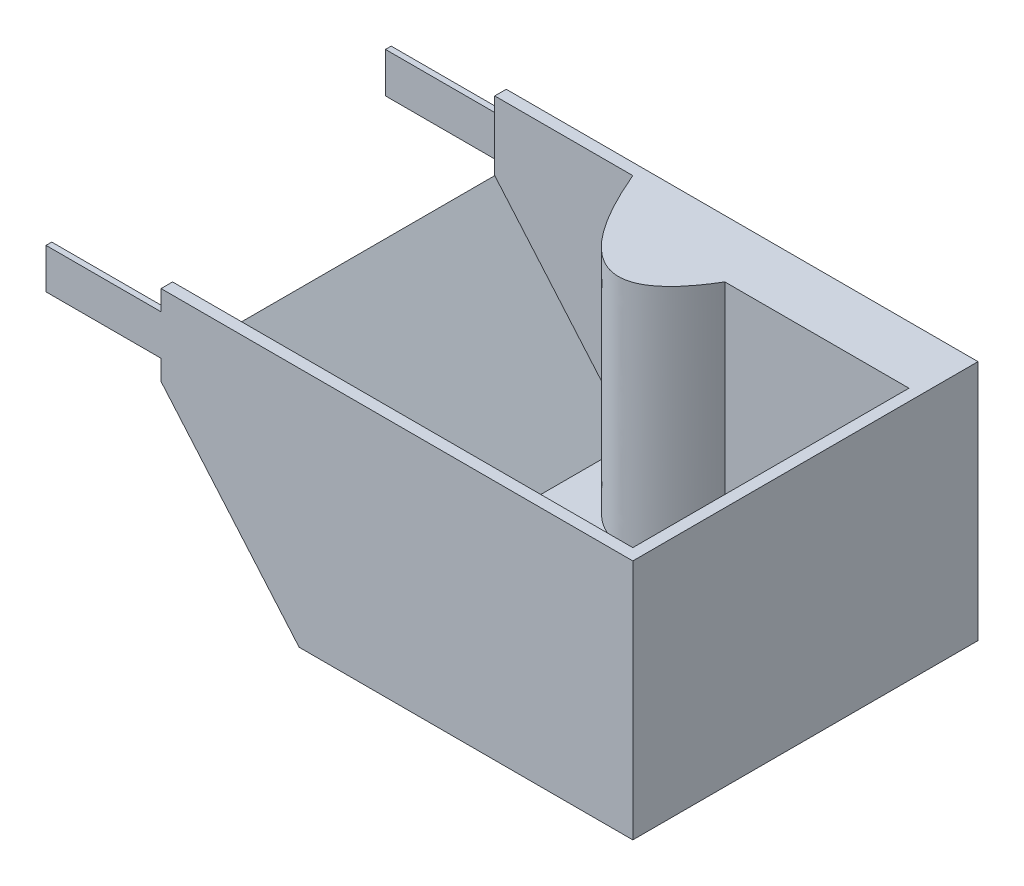
ISO-10303-21;
HEADER;
FILE_DESCRIPTION(('STEP AP214'),'2;1');
FILE_NAME('part.step','',(''),(''),'','','');
FILE_SCHEMA(('AUTOMOTIVE_DESIGN { 1 0 10303 214 1 1 1 1 }'));
ENDSEC;
DATA;
#1=APPLICATION_CONTEXT('core data for automotive mechanical design processes');
#2=APPLICATION_PROTOCOL_DEFINITION('international standard','automotive_design',2000,#1);
#3=PRODUCT_CONTEXT('',#1,'mechanical');
#4=PRODUCT('Part','Part','',(#3));
#5=PRODUCT_RELATED_PRODUCT_CATEGORY('part','',(#4));
#6=PRODUCT_DEFINITION_FORMATION('','',#4);
#7=PRODUCT_DEFINITION_CONTEXT('part definition',#1,'design');
#8=PRODUCT_DEFINITION('design','',#6,#7);
#9=PRODUCT_DEFINITION_SHAPE('','',#8);
#10=(LENGTH_UNIT() NAMED_UNIT(*) SI_UNIT(.MILLI.,.METRE.));
#11=(NAMED_UNIT(*) PLANE_ANGLE_UNIT() SI_UNIT($,.RADIAN.));
#12=(NAMED_UNIT(*) SI_UNIT($,.STERADIAN.) SOLID_ANGLE_UNIT());
#13=UNCERTAINTY_MEASURE_WITH_UNIT(LENGTH_MEASURE(1.E-05),#10,'distance_accuracy_value','');
#14=(GEOMETRIC_REPRESENTATION_CONTEXT(3) GLOBAL_UNCERTAINTY_ASSIGNED_CONTEXT((#13)) GLOBAL_UNIT_ASSIGNED_CONTEXT((#10,
#11,#12)) REPRESENTATION_CONTEXT('',''));
#15=CARTESIAN_POINT('',(0.,0.,0.));
#16=DIRECTION('',(0.,0.,1.));
#17=DIRECTION('',(1.,0.,0.));
#18=AXIS2_PLACEMENT_3D('',#15,#16,#17);
#19=CARTESIAN_POINT('',(0.,0.,0.));
#20=DIRECTION('',(0.,1.,0.));
#21=DIRECTION('',(0.,0.,1.));
#22=AXIS2_PLACEMENT_3D('',#19,#20,#21);
#23=PLANE('',#22);
#24=DIRECTION('',(1.,0.,0.));
#25=VECTOR('',#24,1.);
#26=CARTESIAN_POINT('',(205.,0.,75.));
#27=LINE('',#26,#25);
#28=CARTESIAN_POINT('',(60.,0.,75.));
#29=VERTEX_POINT('',#28);
#30=CARTESIAN_POINT('',(205.,0.,75.));
#31=VERTEX_POINT('',#30);
#32=EDGE_CURVE('E399',#29,#31,#27,.T.);
#33=ORIENTED_EDGE('',*,*,#32,.F.);
#34=DIRECTION('',(0.,0.,1.));
#35=VECTOR('',#34,1.);
#36=CARTESIAN_POINT('',(59.9999999999999,0.,0.));
#37=LINE('',#36,#35);
#38=CARTESIAN_POINT('',(60.,0.,-75.));
#39=VERTEX_POINT('',#38);
#40=EDGE_CURVE('E419',#39,#29,#37,.T.);
#41=ORIENTED_EDGE('',*,*,#40,.F.);
#42=DIRECTION('',(-1.,0.,0.));
#43=VECTOR('',#42,1.);
#44=CARTESIAN_POINT('',(205.,0.,-75.));
#45=LINE('',#44,#43);
#46=CARTESIAN_POINT('',(205.,0.,-75.));
#47=VERTEX_POINT('',#46);
#48=EDGE_CURVE('E362',#47,#39,#45,.T.);
#49=ORIENTED_EDGE('',*,*,#48,.F.);
#50=DIRECTION('',(0.,0.,-1.));
#51=VECTOR('',#50,1.);
#52=CARTESIAN_POINT('',(205.,0.,70.));
#53=LINE('',#52,#51);
#54=EDGE_CURVE('E412',#31,#47,#53,.T.);
#55=ORIENTED_EDGE('',*,*,#54,.F.);
#56=EDGE_LOOP('',(#33,#41,#49,#55));
#57=FACE_BOUND('',#56,.T.);
#58=DIRECTION('',(-0.441048342692887,0.,-0.897483347705047));
#59=VECTOR('',#58,1.);
#60=CARTESIAN_POINT('',(80.5243463199901,0.,-39.5719091409054));
#61=LINE('',#60,#59);
#62=CARTESIAN_POINT('',(74.1645236577121,0.,-52.5134268414404));
#63=VERTEX_POINT('',#62);
#64=CARTESIAN_POINT('',(65.5711340079739,0.,-70.0000000000461));
#65=VERTEX_POINT('',#64);
#66=EDGE_CURVE('E11',#63,#65,#61,.T.);
#67=ORIENTED_EDGE('',*,*,#66,.F.);
#68=CARTESIAN_POINT('',(117.163331799698,0.,-55.0000000000231));
#69=CARTESIAN_POINT('',(116.553479191234,0.,-53.981059510543));
#70=CARTESIAN_POINT('',(115.343994579537,0.,-51.9514046548711));
#71=CARTESIAN_POINT('',(113.624065501285,0.,-49.1814546831016));
#72=CARTESIAN_POINT('',(110.189825419192,0.,-44.2104508586249));
#73=CARTESIAN_POINT('',(105.056898875719,0.,-38.4546529421594));
#74=CARTESIAN_POINT('',(100.423455415618,0.,-35.2649296639802));
#75=CARTESIAN_POINT('',(97.5016606306143,0.,-34.1854911410515));
#76=CARTESIAN_POINT('',(95.3279976327904,0.,-33.8470054094748));
#77=CARTESIAN_POINT('',(93.1935049100601,0.,-33.9721451617414));
#78=CARTESIAN_POINT('',(90.3912236348587,0.,-34.735002624501));
#79=CARTESIAN_POINT('',(85.9480138081782,0.,-37.3661686518529));
#80=CARTESIAN_POINT('',(78.7900084926035,0.,-44.7360629850614));
#81=CARTESIAN_POINT('',(74.1645236577121,0.,-52.5134268414404));
#82=B_SPLINE_CURVE_WITH_KNOTS('',2,(#68,#69,#70,#71,#72,#73,#74,#75,#76,#77,#78,#79,#80,#81),
.UNSPECIFIED.,.F.,.F.,(3,1,1,1,1,1,1,1,1,1,1,1,3),(-0.0287937041367771,-0.00472778565105365,
0.0193381328346698,0.0674699698061166,0.16373364374901,0.292085209006202,0.388348882949095,
0.452524665577691,0.516700448206287,0.580876230834882,0.677139904777776,0.805491470034968,
0.998018817920755),.UNSPECIFIED.);
#83=CARTESIAN_POINT('',(117.163331799698,0.,-55.0000000000231));
#84=VERTEX_POINT('',#83);
#85=EDGE_CURVE('E484',#84,#63,#82,.T.);
#86=ORIENTED_EDGE('',*,*,#85,.F.);
#87=DIRECTION('',(1.,0.,0.));
#88=VECTOR('',#87,1.);
#89=CARTESIAN_POINT('',(0.,0.,-55.0000000000231));
#90=LINE('',#89,#88);
#91=CARTESIAN_POINT('',(195.,0.,-55.0000000000231));
#92=VERTEX_POINT('',#91);
#93=EDGE_CURVE('E489',#84,#92,#90,.T.);
#94=ORIENTED_EDGE('',*,*,#93,.T.);
#95=DIRECTION('',(0.,0.,-1.));
#96=VECTOR('',#95,1.);
#97=CARTESIAN_POINT('',(195.,0.,0.));
#98=LINE('',#97,#96);
#99=CARTESIAN_POINT('',(195.,0.,-70.0000000000461));
#100=VERTEX_POINT('',#99);
#101=EDGE_CURVE('E496',#92,#100,#98,.T.);
#102=ORIENTED_EDGE('',*,*,#101,.T.);
#103=DIRECTION('',(1.,0.,0.));
#104=VECTOR('',#103,1.);
#105=CARTESIAN_POINT('',(0.,0.,-70.0000000000461));
#106=LINE('',#105,#104);
#107=EDGE_CURVE('E50',#65,#100,#106,.T.);
#108=ORIENTED_EDGE('',*,*,#107,.F.);
#109=EDGE_LOOP('',(#67,#86,#94,#102,#108));
#110=FACE_BOUND('',#109,.T.);
#111=ADVANCED_FACE('F40',(#57,#110),#23,.F.);
#112=CARTESIAN_POINT('',(0.,0.,70.));
#113=DIRECTION('',(0.,0.,-1.));
#114=DIRECTION('',(-1.,0.,0.));
#115=AXIS2_PLACEMENT_3D('',#112,#113,#114);
#116=PLANE('',#115);
#117=DIRECTION('',(1.,0.,0.));
#118=VECTOR('',#117,1.);
#119=CARTESIAN_POINT('',(0.,5.,70.));
#120=LINE('',#119,#118);
#121=CARTESIAN_POINT('',(59.9999999999999,5.,70.));
#122=VERTEX_POINT('',#121);
#123=CARTESIAN_POINT('',(200.,5.,70.));
#124=VERTEX_POINT('',#123);
#125=EDGE_CURVE('E429',#122,#124,#120,.T.);
#126=ORIENTED_EDGE('',*,*,#125,.F.);
#127=DIRECTION('',(-0.650791373455968,0.759256602365297,0.));
#128=VECTOR('',#127,1.);
#129=CARTESIAN_POINT('',(59.9999999999999,5.,70.));
#130=LINE('',#129,#128);
#131=CARTESIAN_POINT('',(0.,75.,70.));
#132=VERTEX_POINT('',#131);
#133=EDGE_CURVE('E344',#122,#132,#130,.T.);
#134=ORIENTED_EDGE('',*,*,#133,.T.);
#135=DIRECTION('',(0.,-1.,0.));
#136=VECTOR('',#135,1.);
#137=CARTESIAN_POINT('',(0.,105.,70.));
#138=LINE('',#137,#136);
#139=CARTESIAN_POINT('',(0.,105.,70.));
#140=VERTEX_POINT('',#139);
#141=EDGE_CURVE('E391',#140,#132,#138,.T.);
#142=ORIENTED_EDGE('',*,*,#141,.F.);
#143=DIRECTION('',(-1.,0.,0.));
#144=VECTOR('',#143,1.);
#145=CARTESIAN_POINT('',(205.,105.,70.));
#146=LINE('',#145,#144);
#147=CARTESIAN_POINT('',(200.,105.,70.));
#148=VERTEX_POINT('',#147);
#149=EDGE_CURVE('E385',#148,#140,#146,.T.);
#150=ORIENTED_EDGE('',*,*,#149,.F.);
#151=DIRECTION('',(0.,-1.,0.));
#152=VECTOR('',#151,1.);
#153=CARTESIAN_POINT('',(200.,0.,70.));
#154=LINE('',#153,#152);
#155=EDGE_CURVE('E411',#148,#124,#154,.T.);
#156=ORIENTED_EDGE('',*,*,#155,.T.);
#157=EDGE_LOOP('',(#126,#134,#142,#150,#156));
#158=FACE_BOUND('',#157,.T.);
#159=ADVANCED_FACE('F517',(#158),#116,.T.);
#160=CARTESIAN_POINT('',(0.,0.,-70.));
#161=DIRECTION('',(0.,0.,1.));
#162=DIRECTION('',(1.,0.,0.));
#163=AXIS2_PLACEMENT_3D('',#160,#161,#162);
#164=PLANE('',#163);
#165=DIRECTION('',(0.,1.,0.));
#166=VECTOR('',#165,1.);
#167=CARTESIAN_POINT('',(0.,0.,-70.));
#168=LINE('',#167,#166);
#169=CARTESIAN_POINT('',(0.,75.,-70.));
#170=VERTEX_POINT('',#169);
#171=CARTESIAN_POINT('',(0.,105.,-70.));
#172=VERTEX_POINT('',#171);
#173=EDGE_CURVE('E357',#170,#172,#168,.T.);
#174=ORIENTED_EDGE('',*,*,#173,.F.);
#175=DIRECTION('',(-0.650791373455968,0.759256602365297,0.));
#176=VECTOR('',#175,1.);
#177=CARTESIAN_POINT('',(59.9999999999999,5.,-70.));
#178=LINE('',#177,#176);
#179=CARTESIAN_POINT('',(59.9999999999999,5.,-70.));
#180=VERTEX_POINT('',#179);
#181=EDGE_CURVE('E343',#180,#170,#178,.T.);
#182=ORIENTED_EDGE('',*,*,#181,.F.);
#183=DIRECTION('',(0.,-1.,0.));
#184=VECTOR('',#183,1.);
#185=CARTESIAN_POINT('',(59.9999999999999,105.,-70.));
#186=LINE('',#185,#184);
#187=CARTESIAN_POINT('',(60.,105.,-70.));
#188=VERTEX_POINT('',#187);
#189=EDGE_CURVE('E459',#188,#180,#186,.T.);
#190=ORIENTED_EDGE('',*,*,#189,.F.);
#191=DIRECTION('',(1.,0.,0.));
#192=VECTOR('',#191,1.);
#193=CARTESIAN_POINT('',(205.,105.,-70.));
#194=LINE('',#193,#192);
#195=EDGE_CURVE('E363',#172,#188,#194,.T.);
#196=ORIENTED_EDGE('',*,*,#195,.F.);
#197=EDGE_LOOP('',(#174,#182,#190,#196));
#198=FACE_BOUND('',#197,.T.);
#199=ADVANCED_FACE('F525',(#198),#164,.T.);
#200=CARTESIAN_POINT('',(59.9999999999999,105.,-70.));
#201=CARTESIAN_POINT('',(89.7639468296247,105.,0.562785514085895));
#202=CARTESIAN_POINT('',(120.,105.,-50.));
#203=B_SPLINE_CURVE_WITH_KNOTS('',2,(#200,#201,#202),.UNSPECIFIED.,.F.,.F.,(3,3),(0.,1.),.UNSPECIFIED.);
#204=DIRECTION('',(0.,-1.,0.));
#205=VECTOR('',#204,1.);
#206=SURFACE_OF_LINEAR_EXTRUSION('',#203,#205);
#207=ORIENTED_EDGE('',*,*,#189,.T.);
#208=CARTESIAN_POINT('',(59.9999999999999,5.,-70.));
#209=CARTESIAN_POINT('',(89.7639468296247,5.,0.562785514085895));
#210=CARTESIAN_POINT('',(120.,5.,-50.));
#211=B_SPLINE_CURVE_WITH_KNOTS('',2,(#208,#209,#210),.UNSPECIFIED.,.F.,.F.,(3,3),(0.,1.),.UNSPECIFIED.);
#212=CARTESIAN_POINT('',(120.,5.,-50.));
#213=VERTEX_POINT('',#212);
#214=EDGE_CURVE('E430',#180,#213,#211,.T.);
#215=ORIENTED_EDGE('',*,*,#214,.T.);
#216=DIRECTION('',(0.,-1.,0.));
#217=VECTOR('',#216,1.);
#218=CARTESIAN_POINT('',(120.,105.,-50.));
#219=LINE('',#218,#217);
#220=CARTESIAN_POINT('',(120.,105.,-50.));
#221=VERTEX_POINT('',#220);
#222=EDGE_CURVE('E456',#221,#213,#219,.T.);
#223=ORIENTED_EDGE('',*,*,#222,.F.);
#224=EDGE_CURVE('E439',#188,#221,#203,.T.);
#225=ORIENTED_EDGE('',*,*,#224,.F.);
#226=EDGE_LOOP('',(#207,#215,#223,#225));
#227=FACE_BOUND('',#226,.T.);
#228=ADVANCED_FACE('F42',(#227),#206,.F.);
#229=CARTESIAN_POINT('',(0.,105.,-50.));
#230=DIRECTION('',(0.,0.,1.));
#231=DIRECTION('',(1.,0.,0.));
#232=AXIS2_PLACEMENT_3D('',#229,#230,#231);
#233=PLANE('',#232);
#234=DIRECTION('',(-1.,0.,0.));
#235=VECTOR('',#234,1.);
#236=CARTESIAN_POINT('',(0.,5.,-50.));
#237=LINE('',#236,#235);
#238=CARTESIAN_POINT('',(200.,5.,-50.));
#239=VERTEX_POINT('',#238);
#240=EDGE_CURVE('E437',#239,#213,#237,.T.);
#241=ORIENTED_EDGE('',*,*,#240,.F.);
#242=DIRECTION('',(0.,-1.,0.));
#243=VECTOR('',#242,1.);
#244=CARTESIAN_POINT('',(200.,105.,-50.));
#245=LINE('',#244,#243);
#246=CARTESIAN_POINT('',(200.,105.,-50.));
#247=VERTEX_POINT('',#246);
#248=EDGE_CURVE('E452',#247,#239,#245,.T.);
#249=ORIENTED_EDGE('',*,*,#248,.F.);
#250=DIRECTION('',(-1.,0.,0.));
#251=VECTOR('',#250,1.);
#252=CARTESIAN_POINT('',(0.,105.,-50.));
#253=LINE('',#252,#251);
#254=EDGE_CURVE('E445',#247,#221,#253,.T.);
#255=ORIENTED_EDGE('',*,*,#254,.T.);
#256=ORIENTED_EDGE('',*,*,#222,.T.);
#257=EDGE_LOOP('',(#241,#249,#255,#256));
#258=FACE_BOUND('',#257,.T.);
#259=ADVANCED_FACE('F532',(#258),#233,.T.);
#260=CARTESIAN_POINT('',(0.,105.,0.));
#261=DIRECTION('',(0.,1.,0.));
#262=DIRECTION('',(0.,0.,1.));
#263=AXIS2_PLACEMENT_3D('',#260,#261,#262);
#264=PLANE('',#263);
#265=DIRECTION('',(0.,0.,1.));
#266=VECTOR('',#265,1.);
#267=CARTESIAN_POINT('',(205.,105.,70.));
#268=LINE('',#267,#266);
#269=CARTESIAN_POINT('',(205.,105.,-75.));
#270=VERTEX_POINT('',#269);
#271=CARTESIAN_POINT('',(205.,105.,75.));
#272=VERTEX_POINT('',#271);
#273=EDGE_CURVE('E415',#270,#272,#268,.T.);
#274=ORIENTED_EDGE('',*,*,#273,.F.);
#275=DIRECTION('',(1.,0.,0.));
#276=VECTOR('',#275,1.);
#277=CARTESIAN_POINT('',(205.,105.,-75.));
#278=LINE('',#277,#276);
#279=CARTESIAN_POINT('',(0.,105.,-75.));
#280=VERTEX_POINT('',#279);
#281=EDGE_CURVE('E372',#280,#270,#278,.T.);
#282=ORIENTED_EDGE('',*,*,#281,.F.);
#283=DIRECTION('',(0.,0.,1.));
#284=VECTOR('',#283,1.);
#285=CARTESIAN_POINT('',(0.,105.,-75.));
#286=LINE('',#285,#284);
#287=EDGE_CURVE('E376',#280,#172,#286,.T.);
#288=ORIENTED_EDGE('',*,*,#287,.T.);
#289=ORIENTED_EDGE('',*,*,#195,.T.);
#290=ORIENTED_EDGE('',*,*,#224,.T.);
#291=ORIENTED_EDGE('',*,*,#254,.F.);
#292=DIRECTION('',(0.,0.,1.));
#293=VECTOR('',#292,1.);
#294=CARTESIAN_POINT('',(200.,105.,70.));
#295=LINE('',#294,#293);
#296=EDGE_CURVE('E416',#247,#148,#295,.T.);
#297=ORIENTED_EDGE('',*,*,#296,.T.);
#298=ORIENTED_EDGE('',*,*,#149,.T.);
#299=DIRECTION('',(0.,0.,-1.));
#300=VECTOR('',#299,1.);
#301=CARTESIAN_POINT('',(0.,105.,75.));
#302=LINE('',#301,#300);
#303=CARTESIAN_POINT('',(0.,105.,75.));
#304=VERTEX_POINT('',#303);
#305=EDGE_CURVE('E402',#304,#140,#302,.T.);
#306=ORIENTED_EDGE('',*,*,#305,.F.);
#307=DIRECTION('',(-1.,0.,0.));
#308=VECTOR('',#307,1.);
#309=CARTESIAN_POINT('',(205.,105.,75.));
#310=LINE('',#309,#308);
#311=EDGE_CURVE('E390',#272,#304,#310,.T.);
#312=ORIENTED_EDGE('',*,*,#311,.F.);
#313=EDGE_LOOP('',(#274,#282,#288,#289,#290,#291,#297,#298,#306,#312));
#314=FACE_BOUND('',#313,.T.);
#315=ADVANCED_FACE('F530',(#314),#264,.T.);
#316=CARTESIAN_POINT('',(0.,5.,0.));
#317=DIRECTION('',(0.,1.,0.));
#318=DIRECTION('',(0.,0.,1.));
#319=AXIS2_PLACEMENT_3D('',#316,#317,#318);
#320=PLANE('',#319);
#321=ORIENTED_EDGE('',*,*,#214,.F.);
#322=DIRECTION('',(0.,0.,1.));
#323=VECTOR('',#322,1.);
#324=CARTESIAN_POINT('',(59.9999999999999,5.,0.));
#325=LINE('',#324,#323);
#326=EDGE_CURVE('E425',#180,#122,#325,.T.);
#327=ORIENTED_EDGE('',*,*,#326,.T.);
#328=ORIENTED_EDGE('',*,*,#125,.T.);
#329=DIRECTION('',(0.,0.,1.));
#330=VECTOR('',#329,1.);
#331=CARTESIAN_POINT('',(200.,5.,0.));
#332=LINE('',#331,#330);
#333=EDGE_CURVE('E433',#239,#124,#332,.T.);
#334=ORIENTED_EDGE('',*,*,#333,.F.);
#335=ORIENTED_EDGE('',*,*,#240,.T.);
#336=EDGE_LOOP('',(#321,#327,#328,#334,#335));
#337=FACE_BOUND('',#336,.T.);
#338=ADVANCED_FACE('F539',(#337),#320,.T.);
#339=CARTESIAN_POINT('',(205.,0.,0.));
#340=DIRECTION('',(-1.,0.,0.));
#341=DIRECTION('',(0.,0.,1.));
#342=AXIS2_PLACEMENT_3D('',#339,#340,#341);
#343=PLANE('',#342);
#344=ORIENTED_EDGE('',*,*,#273,.T.);
#345=DIRECTION('',(0.,1.,0.));
#346=VECTOR('',#345,1.);
#347=CARTESIAN_POINT('',(205.,105.,75.));
#348=LINE('',#347,#346);
#349=EDGE_CURVE('E386',#31,#272,#348,.T.);
#350=ORIENTED_EDGE('',*,*,#349,.F.);
#351=ORIENTED_EDGE('',*,*,#54,.T.);
#352=DIRECTION('',(0.,-1.,0.));
#353=VECTOR('',#352,1.);
#354=CARTESIAN_POINT('',(205.,0.,-75.));
#355=LINE('',#354,#353);
#356=EDGE_CURVE('E358',#270,#47,#355,.T.);
#357=ORIENTED_EDGE('',*,*,#356,.F.);
#358=EDGE_LOOP('',(#344,#350,#351,#357));
#359=FACE_BOUND('',#358,.T.);
#360=ADVANCED_FACE('F573',(#359),#343,.F.);
#361=CARTESIAN_POINT('',(200.,0.,0.));
#362=DIRECTION('',(-1.,0.,0.));
#363=DIRECTION('',(0.,0.,1.));
#364=AXIS2_PLACEMENT_3D('',#361,#362,#363);
#365=PLANE('',#364);
#366=ORIENTED_EDGE('',*,*,#296,.F.);
#367=ORIENTED_EDGE('',*,*,#248,.T.);
#368=ORIENTED_EDGE('',*,*,#333,.T.);
#369=ORIENTED_EDGE('',*,*,#155,.F.);
#370=EDGE_LOOP('',(#366,#367,#368,#369));
#371=FACE_BOUND('',#370,.T.);
#372=ADVANCED_FACE('F549',(#371),#365,.T.);
#373=CARTESIAN_POINT('',(0.,105.,75.));
#374=DIRECTION('',(1.,0.,0.));
#375=DIRECTION('',(0.,1.,0.));
#376=AXIS2_PLACEMENT_3D('',#373,#374,#375);
#377=PLANE('',#376);
#378=DIRECTION('',(0.,1.,0.));
#379=VECTOR('',#378,1.);
#380=CARTESIAN_POINT('',(0.,0.,-75.));
#381=LINE('',#380,#379);
#382=CARTESIAN_POINT('',(0.,96.25,-75.));
#383=VERTEX_POINT('',#382);
#384=EDGE_CURVE('E367',#383,#280,#381,.T.);
#385=ORIENTED_EDGE('',*,*,#384,.F.);
#386=DIRECTION('',(0.,0.,1.));
#387=VECTOR('',#386,1.);
#388=CARTESIAN_POINT('',(0.,96.25,75.));
#389=LINE('',#388,#387);
#390=CARTESIAN_POINT('',(0.,96.25,-72.5));
#391=VERTEX_POINT('',#390);
#392=EDGE_CURVE('E296',#383,#391,#389,.T.);
#393=ORIENTED_EDGE('',*,*,#392,.T.);
#394=DIRECTION('',(0.,1.,0.));
#395=VECTOR('',#394,1.);
#396=CARTESIAN_POINT('',(0.,105.,-72.5));
#397=LINE('',#396,#395);
#398=CARTESIAN_POINT('',(0.,78.75,-72.5));
#399=VERTEX_POINT('',#398);
#400=EDGE_CURVE('E481',#399,#391,#397,.T.);
#401=ORIENTED_EDGE('',*,*,#400,.F.);
#402=DIRECTION('',(0.,0.,1.));
#403=VECTOR('',#402,1.);
#404=CARTESIAN_POINT('',(0.,78.75,75.));
#405=LINE('',#404,#403);
#406=CARTESIAN_POINT('',(0.,78.75,-75.));
#407=VERTEX_POINT('',#406);
#408=EDGE_CURVE('E290',#407,#399,#405,.T.);
#409=ORIENTED_EDGE('',*,*,#408,.F.);
#410=CARTESIAN_POINT('',(0.,70.,-75.));
#411=VERTEX_POINT('',#410);
#412=EDGE_CURVE('E368',#411,#407,#381,.T.);
#413=ORIENTED_EDGE('',*,*,#412,.F.);
#414=DIRECTION('',(0.,0.,-1.));
#415=VECTOR('',#414,1.);
#416=CARTESIAN_POINT('',(0.,70.,70.));
#417=LINE('',#416,#415);
#418=CARTESIAN_POINT('',(0.,70.,75.));
#419=VERTEX_POINT('',#418);
#420=EDGE_CURVE('E354',#419,#411,#417,.T.);
#421=ORIENTED_EDGE('',*,*,#420,.F.);
#422=DIRECTION('',(0.,-1.,0.));
#423=VECTOR('',#422,1.);
#424=CARTESIAN_POINT('',(0.,105.,75.));
#425=LINE('',#424,#423);
#426=CARTESIAN_POINT('',(0.,78.75,75.));
#427=VERTEX_POINT('',#426);
#428=EDGE_CURVE('E394',#427,#419,#425,.T.);
#429=ORIENTED_EDGE('',*,*,#428,.F.);
#430=DIRECTION('',(0.,0.,-1.));
#431=VECTOR('',#430,1.);
#432=CARTESIAN_POINT('',(0.,78.75,75.));
#433=LINE('',#432,#431);
#434=CARTESIAN_POINT('',(0.,78.75,72.5));
#435=VERTEX_POINT('',#434);
#436=EDGE_CURVE('E331',#427,#435,#433,.T.);
#437=ORIENTED_EDGE('',*,*,#436,.T.);
#438=DIRECTION('',(0.,-1.,0.));
#439=VECTOR('',#438,1.);
#440=CARTESIAN_POINT('',(0.,105.,72.5));
#441=LINE('',#440,#439);
#442=CARTESIAN_POINT('',(0.,96.25,72.5));
#443=VERTEX_POINT('',#442);
#444=EDGE_CURVE('E475',#443,#435,#441,.T.);
#445=ORIENTED_EDGE('',*,*,#444,.F.);
#446=DIRECTION('',(0.,0.,-1.));
#447=VECTOR('',#446,1.);
#448=CARTESIAN_POINT('',(0.,96.25,75.));
#449=LINE('',#448,#447);
#450=CARTESIAN_POINT('',(0.,96.25,75.));
#451=VERTEX_POINT('',#450);
#452=EDGE_CURVE('E326',#451,#443,#449,.T.);
#453=ORIENTED_EDGE('',*,*,#452,.F.);
#454=EDGE_CURVE('E395',#304,#451,#425,.T.);
#455=ORIENTED_EDGE('',*,*,#454,.F.);
#456=ORIENTED_EDGE('',*,*,#305,.T.);
#457=ORIENTED_EDGE('',*,*,#141,.T.);
#458=DIRECTION('',(0.,0.,-1.));
#459=VECTOR('',#458,1.);
#460=CARTESIAN_POINT('',(0.,75.,70.));
#461=LINE('',#460,#459);
#462=EDGE_CURVE('E348',#132,#170,#461,.T.);
#463=ORIENTED_EDGE('',*,*,#462,.T.);
#464=ORIENTED_EDGE('',*,*,#173,.T.);
#465=ORIENTED_EDGE('',*,*,#287,.F.);
#466=EDGE_LOOP('',(#385,#393,#401,#409,#413,#421,#429,#437,#445,#453,#455,#456,#457,#463,#464,#465));
#467=FACE_BOUND('',#466,.T.);
#468=ADVANCED_FACE('F562',(#467),#377,.F.);
#469=CARTESIAN_POINT('',(0.,0.,75.));
#470=DIRECTION('',(0.,0.,-1.));
#471=DIRECTION('',(-1.,0.,0.));
#472=AXIS2_PLACEMENT_3D('',#469,#470,#471);
#473=PLANE('',#472);
#474=ORIENTED_EDGE('',*,*,#454,.T.);
#475=DIRECTION('',(1.,0.,0.));
#476=VECTOR('',#475,1.);
#477=CARTESIAN_POINT('',(0.,96.25,75.));
#478=LINE('',#477,#476);
#479=CARTESIAN_POINT('',(-50.,96.25,75.));
#480=VERTEX_POINT('',#479);
#481=EDGE_CURVE('E300',#480,#451,#478,.T.);
#482=ORIENTED_EDGE('',*,*,#481,.F.);
#483=DIRECTION('',(0.,-1.,0.));
#484=VECTOR('',#483,1.);
#485=CARTESIAN_POINT('',(-50.,0.,75.));
#486=LINE('',#485,#484);
#487=CARTESIAN_POINT('',(-50.,78.75,75.));
#488=VERTEX_POINT('',#487);
#489=EDGE_CURVE('E317',#480,#488,#486,.T.);
#490=ORIENTED_EDGE('',*,*,#489,.T.);
#491=DIRECTION('',(1.,0.,0.));
#492=VECTOR('',#491,1.);
#493=CARTESIAN_POINT('',(0.,78.75,75.));
#494=LINE('',#493,#492);
#495=EDGE_CURVE('E306',#488,#427,#494,.T.);
#496=ORIENTED_EDGE('',*,*,#495,.T.);
#497=ORIENTED_EDGE('',*,*,#428,.T.);
#498=DIRECTION('',(-0.650791373455968,0.759256602365297,0.));
#499=VECTOR('',#498,1.);
#500=CARTESIAN_POINT('',(60.,0.,75.));
#501=LINE('',#500,#499);
#502=EDGE_CURVE('E335',#29,#419,#501,.T.);
#503=ORIENTED_EDGE('',*,*,#502,.F.);
#504=ORIENTED_EDGE('',*,*,#32,.T.);
#505=ORIENTED_EDGE('',*,*,#349,.T.);
#506=ORIENTED_EDGE('',*,*,#311,.T.);
#507=EDGE_LOOP('',(#474,#482,#490,#496,#497,#503,#504,#505,#506));
#508=FACE_BOUND('',#507,.T.);
#509=ADVANCED_FACE('F569',(#508),#473,.F.);
#510=CARTESIAN_POINT('',(0.,0.,-75.));
#511=DIRECTION('',(0.,0.,1.));
#512=DIRECTION('',(1.,0.,0.));
#513=AXIS2_PLACEMENT_3D('',#510,#511,#512);
#514=PLANE('',#513);
#515=ORIENTED_EDGE('',*,*,#412,.T.);
#516=DIRECTION('',(1.,0.,0.));
#517=VECTOR('',#516,1.);
#518=CARTESIAN_POINT('',(0.,78.75,-75.));
#519=LINE('',#518,#517);
#520=CARTESIAN_POINT('',(-50.,78.75,-75.));
#521=VERTEX_POINT('',#520);
#522=EDGE_CURVE('E282',#521,#407,#519,.T.);
#523=ORIENTED_EDGE('',*,*,#522,.F.);
#524=DIRECTION('',(0.,-1.,0.));
#525=VECTOR('',#524,1.);
#526=CARTESIAN_POINT('',(-50.,0.,-75.));
#527=LINE('',#526,#525);
#528=CARTESIAN_POINT('',(-50.,96.25,-75.));
#529=VERTEX_POINT('',#528);
#530=EDGE_CURVE('E272',#529,#521,#527,.T.);
#531=ORIENTED_EDGE('',*,*,#530,.F.);
#532=DIRECTION('',(1.,0.,0.));
#533=VECTOR('',#532,1.);
#534=CARTESIAN_POINT('',(0.,96.25,-75.));
#535=LINE('',#534,#533);
#536=EDGE_CURVE('E65',#529,#383,#535,.T.);
#537=ORIENTED_EDGE('',*,*,#536,.T.);
#538=ORIENTED_EDGE('',*,*,#384,.T.);
#539=ORIENTED_EDGE('',*,*,#281,.T.);
#540=ORIENTED_EDGE('',*,*,#356,.T.);
#541=ORIENTED_EDGE('',*,*,#48,.T.);
#542=DIRECTION('',(-0.650791373455968,0.759256602365297,0.));
#543=VECTOR('',#542,1.);
#544=CARTESIAN_POINT('',(60.,0.,-75.));
#545=LINE('',#544,#543);
#546=EDGE_CURVE('E339',#39,#411,#545,.T.);
#547=ORIENTED_EDGE('',*,*,#546,.T.);
#548=EDGE_LOOP('',(#515,#523,#531,#537,#538,#539,#540,#541,#547));
#549=FACE_BOUND('',#548,.T.);
#550=ADVANCED_FACE('F576',(#549),#514,.F.);
#551=CARTESIAN_POINT('',(60.,0.,70.));
#552=DIRECTION('',(0.759256602365297,0.650791373455968,0.));
#553=DIRECTION('',(-0.650791373455968,0.759256602365297,0.));
#554=AXIS2_PLACEMENT_3D('',#551,#552,#553);
#555=PLANE('',#554);
#556=ORIENTED_EDGE('',*,*,#420,.T.);
#557=ORIENTED_EDGE('',*,*,#546,.F.);
#558=ORIENTED_EDGE('',*,*,#40,.T.);
#559=ORIENTED_EDGE('',*,*,#502,.T.);
#560=EDGE_LOOP('',(#556,#557,#558,#559));
#561=FACE_BOUND('',#560,.T.);
#562=ADVANCED_FACE('F591',(#561),#555,.F.);
#563=CARTESIAN_POINT('',(59.9999999999999,5.,70.));
#564=DIRECTION('',(-0.759256602365297,-0.650791373455968,0.));
#565=DIRECTION('',(0.650791373455968,-0.759256602365297,0.));
#566=AXIS2_PLACEMENT_3D('',#563,#564,#565);
#567=PLANE('',#566);
#568=ORIENTED_EDGE('',*,*,#181,.T.);
#569=ORIENTED_EDGE('',*,*,#462,.F.);
#570=ORIENTED_EDGE('',*,*,#133,.F.);
#571=ORIENTED_EDGE('',*,*,#326,.F.);
#572=EDGE_LOOP('',(#568,#569,#570,#571));
#573=FACE_BOUND('',#572,.T.);
#574=ADVANCED_FACE('F622',(#573),#567,.F.);
#575=CARTESIAN_POINT('',(0.,0.,72.5));
#576=DIRECTION('',(0.,0.,1.));
#577=DIRECTION('',(1.,0.,0.));
#578=AXIS2_PLACEMENT_3D('',#575,#576,#577);
#579=PLANE('',#578);
#580=DIRECTION('',(1.,0.,0.));
#581=VECTOR('',#580,1.);
#582=CARTESIAN_POINT('',(0.,96.25,72.5));
#583=LINE('',#582,#581);
#584=CARTESIAN_POINT('',(-50.,96.25,72.5));
#585=VERTEX_POINT('',#584);
#586=EDGE_CURVE('E301',#585,#443,#583,.T.);
#587=ORIENTED_EDGE('',*,*,#586,.T.);
#588=ORIENTED_EDGE('',*,*,#444,.T.);
#589=DIRECTION('',(1.,0.,0.));
#590=VECTOR('',#589,1.);
#591=CARTESIAN_POINT('',(0.,78.75,72.5));
#592=LINE('',#591,#590);
#593=CARTESIAN_POINT('',(-50.,78.75,72.5));
#594=VERTEX_POINT('',#593);
#595=EDGE_CURVE('E310',#594,#435,#592,.T.);
#596=ORIENTED_EDGE('',*,*,#595,.F.);
#597=DIRECTION('',(0.,-1.,0.));
#598=VECTOR('',#597,1.);
#599=CARTESIAN_POINT('',(-50.,0.,72.5));
#600=LINE('',#599,#598);
#601=EDGE_CURVE('E305',#585,#594,#600,.T.);
#602=ORIENTED_EDGE('',*,*,#601,.F.);
#603=EDGE_LOOP('',(#587,#588,#596,#602));
#604=FACE_BOUND('',#603,.T.);
#605=ADVANCED_FACE('F618',(#604),#579,.F.);
#606=CARTESIAN_POINT('',(0.,78.75,72.5));
#607=DIRECTION('',(0.,-1.,0.));
#608=DIRECTION('',(0.,0.,-1.));
#609=AXIS2_PLACEMENT_3D('',#606,#607,#608);
#610=PLANE('',#609);
#611=ORIENTED_EDGE('',*,*,#436,.F.);
#612=ORIENTED_EDGE('',*,*,#495,.F.);
#613=DIRECTION('',(0.,0.,1.));
#614=VECTOR('',#613,1.);
#615=CARTESIAN_POINT('',(-50.,78.75,72.5));
#616=LINE('',#615,#614);
#617=EDGE_CURVE('E323',#594,#488,#616,.T.);
#618=ORIENTED_EDGE('',*,*,#617,.F.);
#619=ORIENTED_EDGE('',*,*,#595,.T.);
#620=EDGE_LOOP('',(#611,#612,#618,#619));
#621=FACE_BOUND('',#620,.T.);
#622=ADVANCED_FACE('F621',(#621),#610,.T.);
#623=CARTESIAN_POINT('',(0.,96.25,72.5));
#624=DIRECTION('',(0.,-1.,0.));
#625=DIRECTION('',(0.,0.,-1.));
#626=AXIS2_PLACEMENT_3D('',#623,#624,#625);
#627=PLANE('',#626);
#628=ORIENTED_EDGE('',*,*,#481,.T.);
#629=ORIENTED_EDGE('',*,*,#452,.T.);
#630=ORIENTED_EDGE('',*,*,#586,.F.);
#631=DIRECTION('',(0.,0.,1.));
#632=VECTOR('',#631,1.);
#633=CARTESIAN_POINT('',(-50.,96.25,72.5));
#634=LINE('',#633,#632);
#635=EDGE_CURVE('E314',#585,#480,#634,.T.);
#636=ORIENTED_EDGE('',*,*,#635,.T.);
#637=EDGE_LOOP('',(#628,#629,#630,#636));
#638=FACE_BOUND('',#637,.T.);
#639=ADVANCED_FACE('F626',(#638),#627,.F.);
#640=CARTESIAN_POINT('',(-50.,0.,72.5));
#641=DIRECTION('',(-1.,0.,0.));
#642=DIRECTION('',(0.,0.,1.));
#643=AXIS2_PLACEMENT_3D('',#640,#641,#642);
#644=PLANE('',#643);
#645=ORIENTED_EDGE('',*,*,#489,.F.);
#646=ORIENTED_EDGE('',*,*,#635,.F.);
#647=ORIENTED_EDGE('',*,*,#601,.T.);
#648=ORIENTED_EDGE('',*,*,#617,.T.);
#649=EDGE_LOOP('',(#645,#646,#647,#648));
#650=FACE_BOUND('',#649,.T.);
#651=ADVANCED_FACE('F628',(#650),#644,.T.);
#652=CARTESIAN_POINT('',(0.,0.,-72.5));
#653=DIRECTION('',(0.,0.,-1.));
#654=DIRECTION('',(-1.,0.,0.));
#655=AXIS2_PLACEMENT_3D('',#652,#653,#654);
#656=PLANE('',#655);
#657=DIRECTION('',(1.,0.,0.));
#658=VECTOR('',#657,1.);
#659=CARTESIAN_POINT('',(0.,78.75,-72.5));
#660=LINE('',#659,#658);
#661=CARTESIAN_POINT('',(-50.,78.75,-72.5));
#662=VERTEX_POINT('',#661);
#663=EDGE_CURVE('E271',#662,#399,#660,.T.);
#664=ORIENTED_EDGE('',*,*,#663,.T.);
#665=ORIENTED_EDGE('',*,*,#400,.T.);
#666=DIRECTION('',(1.,0.,0.));
#667=VECTOR('',#666,1.);
#668=CARTESIAN_POINT('',(0.,96.25,-72.5));
#669=LINE('',#668,#667);
#670=CARTESIAN_POINT('',(-50.,96.25,-72.5));
#671=VERTEX_POINT('',#670);
#672=EDGE_CURVE('E267',#671,#391,#669,.T.);
#673=ORIENTED_EDGE('',*,*,#672,.F.);
#674=DIRECTION('',(0.,-1.,0.));
#675=VECTOR('',#674,1.);
#676=CARTESIAN_POINT('',(-50.,0.,-72.5));
#677=LINE('',#676,#675);
#678=EDGE_CURVE('E276',#671,#662,#677,.T.);
#679=ORIENTED_EDGE('',*,*,#678,.T.);
#680=EDGE_LOOP('',(#664,#665,#673,#679));
#681=FACE_BOUND('',#680,.T.);
#682=ADVANCED_FACE('F600',(#681),#656,.F.);
#683=CARTESIAN_POINT('',(0.,96.25,-72.5));
#684=DIRECTION('',(0.,1.,0.));
#685=DIRECTION('',(0.,0.,1.));
#686=AXIS2_PLACEMENT_3D('',#683,#684,#685);
#687=PLANE('',#686);
#688=ORIENTED_EDGE('',*,*,#392,.F.);
#689=ORIENTED_EDGE('',*,*,#536,.F.);
#690=DIRECTION('',(0.,0.,-1.));
#691=VECTOR('',#690,1.);
#692=CARTESIAN_POINT('',(-50.,96.25,-72.5));
#693=LINE('',#692,#691);
#694=EDGE_CURVE('E287',#671,#529,#693,.T.);
#695=ORIENTED_EDGE('',*,*,#694,.F.);
#696=ORIENTED_EDGE('',*,*,#672,.T.);
#697=EDGE_LOOP('',(#688,#689,#695,#696));
#698=FACE_BOUND('',#697,.T.);
#699=ADVANCED_FACE('F602',(#698),#687,.T.);
#700=CARTESIAN_POINT('',(0.,78.75,-72.5));
#701=DIRECTION('',(0.,1.,0.));
#702=DIRECTION('',(0.,0.,1.));
#703=AXIS2_PLACEMENT_3D('',#700,#701,#702);
#704=PLANE('',#703);
#705=ORIENTED_EDGE('',*,*,#522,.T.);
#706=ORIENTED_EDGE('',*,*,#408,.T.);
#707=ORIENTED_EDGE('',*,*,#663,.F.);
#708=DIRECTION('',(0.,0.,-1.));
#709=VECTOR('',#708,1.);
#710=CARTESIAN_POINT('',(-50.,78.75,-72.5));
#711=LINE('',#710,#709);
#712=EDGE_CURVE('E279',#662,#521,#711,.T.);
#713=ORIENTED_EDGE('',*,*,#712,.T.);
#714=EDGE_LOOP('',(#705,#706,#707,#713));
#715=FACE_BOUND('',#714,.T.);
#716=ADVANCED_FACE('F594',(#715),#704,.F.);
#717=CARTESIAN_POINT('',(-50.,0.,-72.5));
#718=DIRECTION('',(1.,0.,0.));
#719=DIRECTION('',(0.,1.,0.));
#720=AXIS2_PLACEMENT_3D('',#717,#718,#719);
#721=PLANE('',#720);
#722=ORIENTED_EDGE('',*,*,#530,.T.);
#723=ORIENTED_EDGE('',*,*,#712,.F.);
#724=ORIENTED_EDGE('',*,*,#678,.F.);
#725=ORIENTED_EDGE('',*,*,#694,.T.);
#726=EDGE_LOOP('',(#722,#723,#724,#725));
#727=FACE_BOUND('',#726,.T.);
#728=ADVANCED_FACE('F605',(#727),#721,.F.);
#729=CARTESIAN_POINT('',(74.1645236577121,-40.,-52.5134268414404));
#730=DIRECTION('',(0.897483347705047,0.,-0.441048342692887));
#731=DIRECTION('',(-0.441048342692887,0.,-0.897483347705047));
#732=AXIS2_PLACEMENT_3D('',#729,#730,#731);
#733=PLANE('',#732);
#734=ORIENTED_EDGE('',*,*,#66,.T.);
#735=DIRECTION('',(0.,1.,0.));
#736=VECTOR('',#735,1.);
#737=CARTESIAN_POINT('',(65.5711340079739,-40.,-70.0000000000461));
#738=LINE('',#737,#736);
#739=CARTESIAN_POINT('',(65.5711340079739,100.,-70.0000000000461));
#740=VERTEX_POINT('',#739);
#741=EDGE_CURVE('E206',#65,#740,#738,.T.);
#742=ORIENTED_EDGE('',*,*,#741,.T.);
#743=CARTESIAN_POINT('',(74.1645236577121,100.,-52.5134268414404));
#744=CARTESIAN_POINT('',(65.5711340079739,100.,-70.0000000000461));
#745=B_SPLINE_CURVE_WITH_KNOTS('',1,(#743,#744),.UNSPECIFIED.,.F.,.F.,(2,2),
(0.00308667899547303,0.319061538330727),.UNSPECIFIED.);
#746=CARTESIAN_POINT('',(74.1645236577121,100.,-52.5134268414404));
#747=VERTEX_POINT('',#746);
#748=EDGE_CURVE('E211',#747,#740,#745,.T.);
#749=ORIENTED_EDGE('',*,*,#748,.F.);
#750=DIRECTION('',(0.,1.,0.));
#751=VECTOR('',#750,1.);
#752=CARTESIAN_POINT('',(74.1645236577121,-40.,-52.5134268414404));
#753=LINE('',#752,#751);
#754=EDGE_CURVE('E254',#63,#747,#753,.T.);
#755=ORIENTED_EDGE('',*,*,#754,.F.);
#756=EDGE_LOOP('',(#734,#742,#749,#755));
#757=FACE_BOUND('',#756,.T.);
#758=ADVANCED_FACE('F208',(#757),#733,.T.);
#759=CARTESIAN_POINT('',(65.5711340079739,-40.,-70.0000000000461));
#760=DIRECTION('',(0.,0.,1.));
#761=DIRECTION('',(1.,0.,0.));
#762=AXIS2_PLACEMENT_3D('',#759,#760,#761);
#763=PLANE('',#762);
#764=ORIENTED_EDGE('',*,*,#107,.T.);
#765=DIRECTION('',(0.,1.,0.));
#766=VECTOR('',#765,1.);
#767=CARTESIAN_POINT('',(195.,-40.,-70.0000000000461));
#768=LINE('',#767,#766);
#769=CARTESIAN_POINT('',(195.,100.,-70.0000000000461));
#770=VERTEX_POINT('',#769);
#771=EDGE_CURVE('E216',#100,#770,#768,.T.);
#772=ORIENTED_EDGE('',*,*,#771,.T.);
#773=DIRECTION('',(1.,0.,0.));
#774=VECTOR('',#773,1.);
#775=CARTESIAN_POINT('',(65.5711340079739,100.,-70.0000000000461));
#776=LINE('',#775,#774);
#777=EDGE_CURVE('E219',#740,#770,#776,.T.);
#778=ORIENTED_EDGE('',*,*,#777,.F.);
#779=ORIENTED_EDGE('',*,*,#741,.F.);
#780=EDGE_LOOP('',(#764,#772,#778,#779));
#781=FACE_BOUND('',#780,.T.);
#782=ADVANCED_FACE('F220',(#781),#763,.T.);
#783=CARTESIAN_POINT('',(195.,-40.,-55.0000000000231));
#784=DIRECTION('',(1.,0.,0.));
#785=DIRECTION('',(0.,0.,-1.));
#786=AXIS2_PLACEMENT_3D('',#783,#784,#785);
#787=PLANE('',#786);
#788=DIRECTION('',(0.,1.,0.));
#789=VECTOR('',#788,1.);
#790=CARTESIAN_POINT('',(195.,-40.,-55.0000000000231));
#791=LINE('',#790,#789);
#792=CARTESIAN_POINT('',(195.,100.,-55.0000000000231));
#793=VERTEX_POINT('',#792);
#794=EDGE_CURVE('E262',#92,#793,#791,.T.);
#795=ORIENTED_EDGE('',*,*,#794,.T.);
#796=DIRECTION('',(0.,0.,-1.));
#797=VECTOR('',#796,1.);
#798=CARTESIAN_POINT('',(195.,100.,-55.0000000000231));
#799=LINE('',#798,#797);
#800=EDGE_CURVE('E226',#793,#770,#799,.T.);
#801=ORIENTED_EDGE('',*,*,#800,.T.);
#802=ORIENTED_EDGE('',*,*,#771,.F.);
#803=ORIENTED_EDGE('',*,*,#101,.F.);
#804=EDGE_LOOP('',(#795,#801,#802,#803));
#805=FACE_BOUND('',#804,.T.);
#806=ADVANCED_FACE('F502',(#805),#787,.F.);
#807=CARTESIAN_POINT('',(117.163331799698,-40.,-55.0000000000231));
#808=DIRECTION('',(0.,0.,1.));
#809=DIRECTION('',(1.,0.,0.));
#810=AXIS2_PLACEMENT_3D('',#807,#808,#809);
#811=PLANE('',#810);
#812=DIRECTION('',(0.,1.,0.));
#813=VECTOR('',#812,1.);
#814=CARTESIAN_POINT('',(117.163331799698,-40.,-55.0000000000231));
#815=LINE('',#814,#813);
#816=CARTESIAN_POINT('',(117.163331799698,100.,-55.0000000000231));
#817=VERTEX_POINT('',#816);
#818=EDGE_CURVE('E57',#84,#817,#815,.T.);
#819=ORIENTED_EDGE('',*,*,#818,.T.);
#820=DIRECTION('',(1.,0.,0.));
#821=VECTOR('',#820,1.);
#822=CARTESIAN_POINT('',(117.163331799698,100.,-55.0000000000231));
#823=LINE('',#822,#821);
#824=EDGE_CURVE('E246',#817,#793,#823,.T.);
#825=ORIENTED_EDGE('',*,*,#824,.T.);
#826=ORIENTED_EDGE('',*,*,#794,.F.);
#827=ORIENTED_EDGE('',*,*,#93,.F.);
#828=EDGE_LOOP('',(#819,#825,#826,#827));
#829=FACE_BOUND('',#828,.T.);
#830=ADVANCED_FACE('F506',(#829),#811,.F.);
#831=CARTESIAN_POINT('',(117.163331799698,-40.,-55.0000000000231));
#832=CARTESIAN_POINT('',(116.553479191234,-40.,-53.981059510543));
#833=CARTESIAN_POINT('',(115.343994579537,-40.,-51.9514046548711));
#834=CARTESIAN_POINT('',(113.624065501285,-40.,-49.1814546831016));
#835=CARTESIAN_POINT('',(110.189825419192,-40.,-44.2104508586249));
#836=CARTESIAN_POINT('',(105.056898875719,-40.,-38.4546529421594));
#837=CARTESIAN_POINT('',(100.423455415618,-40.,-35.2649296639802));
#838=CARTESIAN_POINT('',(97.5016606306143,-40.,-34.1854911410515));
#839=CARTESIAN_POINT('',(95.3279976327904,-40.,-33.8470054094748));
#840=CARTESIAN_POINT('',(93.1935049100601,-40.,-33.9721451617414));
#841=CARTESIAN_POINT('',(90.3912236348587,-40.,-34.735002624501));
#842=CARTESIAN_POINT('',(85.9480138081782,-40.,-37.3661686518529));
#843=CARTESIAN_POINT('',(78.7900084926035,-40.,-44.7360629850614));
#844=CARTESIAN_POINT('',(74.1645236577121,-40.,-52.5134268414404));
#845=B_SPLINE_CURVE_WITH_KNOTS('',2,(#831,#832,#833,#834,#835,#836,#837,#838,#839,#840,#841,
#842,#843,#844),.UNSPECIFIED.,.F.,.F.,(3,1,1,1,1,1,1,1,1,1,1,1,3),(-0.0287937041367771,
-0.00472778565105365,0.0193381328346698,0.0674699698061166,0.16373364374901,0.292085209006202,
0.388348882949095,0.452524665577691,0.516700448206287,0.580876230834882,0.677139904777776,
0.805491470034968,0.998018817920755),.UNSPECIFIED.);
#846=DIRECTION('',(0.,1.,0.));
#847=VECTOR('',#846,1.);
#848=SURFACE_OF_LINEAR_EXTRUSION('',#845,#847);
#849=ORIENTED_EDGE('',*,*,#85,.T.);
#850=ORIENTED_EDGE('',*,*,#754,.T.);
#851=CARTESIAN_POINT('',(117.163331799698,100.,-55.0000000000231));
#852=CARTESIAN_POINT('',(116.553479191234,100.,-53.981059510543));
#853=CARTESIAN_POINT('',(115.343994579537,100.,-51.9514046548711));
#854=CARTESIAN_POINT('',(113.624065501285,100.,-49.1814546831016));
#855=CARTESIAN_POINT('',(110.189825419192,100.,-44.2104508586249));
#856=CARTESIAN_POINT('',(105.056898875719,100.,-38.4546529421594));
#857=CARTESIAN_POINT('',(100.423455415618,100.,-35.2649296639802));
#858=CARTESIAN_POINT('',(97.5016606306143,100.,-34.1854911410515));
#859=CARTESIAN_POINT('',(95.3279976327904,100.,-33.8470054094748));
#860=CARTESIAN_POINT('',(93.1935049100601,100.,-33.9721451617414));
#861=CARTESIAN_POINT('',(90.3912236348587,100.,-34.735002624501));
#862=CARTESIAN_POINT('',(85.9480138081782,100.,-37.3661686518529));
#863=CARTESIAN_POINT('',(78.7900084926035,100.,-44.7360629850614));
#864=CARTESIAN_POINT('',(74.1645236577121,100.,-52.5134268414404));
#865=B_SPLINE_CURVE_WITH_KNOTS('',2,(#851,#852,#853,#854,#855,#856,#857,#858,#859,#860,#861,
#862,#863,#864),.UNSPECIFIED.,.F.,.F.,(3,1,1,1,1,1,1,1,1,1,1,1,3),(-0.0287937041367771,
-0.00472778565105365,0.0193381328346698,0.0674699698061166,0.16373364374901,0.292085209006202,
0.388348882949095,0.452524665577691,0.516700448206287,0.580876230834882,0.677139904777776,
0.805491470034968,0.998018817920755),.UNSPECIFIED.);
#866=EDGE_CURVE('E231',#817,#747,#865,.T.);
#867=ORIENTED_EDGE('',*,*,#866,.F.);
#868=ORIENTED_EDGE('',*,*,#818,.F.);
#869=EDGE_LOOP('',(#849,#850,#867,#868));
#870=FACE_BOUND('',#869,.T.);
#871=ADVANCED_FACE('F507',(#870),#848,.T.);
#872=CARTESIAN_POINT('',(95.3328939171771,100.,-33.9049585949552));
#873=DIRECTION('',(0.,-1.,0.));
#874=DIRECTION('',(0.,0.,-1.));
#875=AXIS2_PLACEMENT_3D('',#872,#873,#874);
#876=PLANE('',#875);
#877=ORIENTED_EDGE('',*,*,#748,.T.);
#878=ORIENTED_EDGE('',*,*,#777,.T.);
#879=ORIENTED_EDGE('',*,*,#800,.F.);
#880=ORIENTED_EDGE('',*,*,#824,.F.);
#881=ORIENTED_EDGE('',*,*,#866,.T.);
#882=EDGE_LOOP('',(#877,#878,#879,#880,#881));
#883=FACE_BOUND('',#882,.T.);
#884=ADVANCED_FACE('F229',(#883),#876,.T.);
#885=CLOSED_SHELL('',(#111,#159,#199,#228,#259,#315,#338,#360,#372,#468,#509,#550,#562,#574,
#605,#622,#639,#651,#682,#699,#716,#728,#758,#782,#806,#830,#871,#884));
#886=MANIFOLD_SOLID_BREP('B2',#885);
#887=ADVANCED_BREP_SHAPE_REPRESENTATION('',(#18,#886),#14);
#888=SHAPE_DEFINITION_REPRESENTATION(#9,#887);
ENDSEC;
END-ISO-10303-21;
